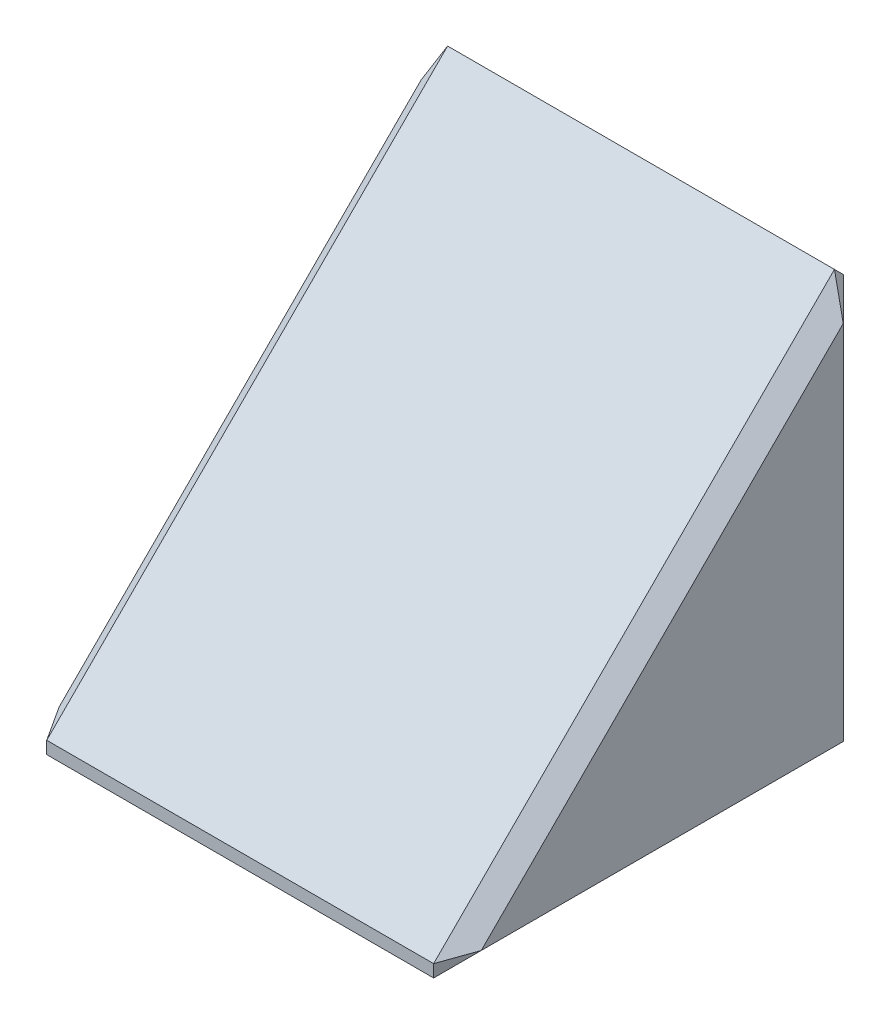
ISO-10303-21;
HEADER;
FILE_DESCRIPTION(('STEP AP214'),'2;1');
FILE_NAME('part.step','',(''),(''),'','','');
FILE_SCHEMA(('AUTOMOTIVE_DESIGN { 1 0 10303 214 1 1 1 1 }'));
ENDSEC;
DATA;
#1=APPLICATION_CONTEXT('core data for automotive mechanical design processes');
#2=APPLICATION_PROTOCOL_DEFINITION('international standard','automotive_design',2000,#1);
#3=PRODUCT_CONTEXT('',#1,'mechanical');
#4=PRODUCT('Part','Part','',(#3));
#5=PRODUCT_RELATED_PRODUCT_CATEGORY('part','',(#4));
#6=PRODUCT_DEFINITION_FORMATION('','',#4);
#7=PRODUCT_DEFINITION_CONTEXT('part definition',#1,'design');
#8=PRODUCT_DEFINITION('design','',#6,#7);
#9=PRODUCT_DEFINITION_SHAPE('','',#8);
#10=(LENGTH_UNIT() NAMED_UNIT(*) SI_UNIT(.MILLI.,.METRE.));
#11=(NAMED_UNIT(*) PLANE_ANGLE_UNIT() SI_UNIT($,.RADIAN.));
#12=(NAMED_UNIT(*) SI_UNIT($,.STERADIAN.) SOLID_ANGLE_UNIT());
#13=UNCERTAINTY_MEASURE_WITH_UNIT(LENGTH_MEASURE(1.E-05),#10,'distance_accuracy_value','');
#14=(GEOMETRIC_REPRESENTATION_CONTEXT(3) GLOBAL_UNCERTAINTY_ASSIGNED_CONTEXT((#13)) GLOBAL_UNIT_ASSIGNED_CONTEXT((#10,
#11,#12)) REPRESENTATION_CONTEXT('',''));
#15=CARTESIAN_POINT('',(0.,0.,0.));
#16=DIRECTION('',(0.,0.,1.));
#17=DIRECTION('',(1.,0.,0.));
#18=AXIS2_PLACEMENT_3D('',#15,#16,#17);
#19=CARTESIAN_POINT('',(1.5,-1.5,1.5));
#20=DIRECTION('',(0.,1.,0.));
#21=DIRECTION('',(0.,0.,1.));
#22=AXIS2_PLACEMENT_3D('',#19,#20,#21);
#23=PLANE('',#22);
#24=DIRECTION('',(0.,0.,1.));
#25=VECTOR('',#24,1.);
#26=CARTESIAN_POINT('',(1.375,-1.5,1.5));
#27=LINE('',#26,#25);
#28=CARTESIAN_POINT('',(1.375,-1.5,-1.375));
#29=VERTEX_POINT('',#28);
#30=CARTESIAN_POINT('',(1.375,-1.5,1.41161165235168));
#31=VERTEX_POINT('',#30);
#32=EDGE_CURVE('E99',#29,#31,#27,.T.);
#33=ORIENTED_EDGE('',*,*,#32,.T.);
#34=DIRECTION('',(-1.,0.,0.));
#35=VECTOR('',#34,1.);
#36=CARTESIAN_POINT('',(1.5,-1.5,1.41161165235168));
#37=LINE('',#36,#35);
#38=CARTESIAN_POINT('',(-1.375,-1.5,1.41161165235168));
#39=VERTEX_POINT('',#38);
#40=EDGE_CURVE('E95',#31,#39,#37,.T.);
#41=ORIENTED_EDGE('',*,*,#40,.T.);
#42=DIRECTION('',(0.,0.,-1.));
#43=VECTOR('',#42,1.);
#44=CARTESIAN_POINT('',(-1.375,-1.5,1.5));
#45=LINE('',#44,#43);
#46=CARTESIAN_POINT('',(-1.375,-1.5,-1.375));
#47=VERTEX_POINT('',#46);
#48=EDGE_CURVE('E90',#39,#47,#45,.T.);
#49=ORIENTED_EDGE('',*,*,#48,.T.);
#50=DIRECTION('',(1.,0.,0.));
#51=VECTOR('',#50,1.);
#52=CARTESIAN_POINT('',(1.5,-1.5,-1.375));
#53=LINE('',#52,#51);
#54=EDGE_CURVE('E92',#47,#29,#53,.T.);
#55=ORIENTED_EDGE('',*,*,#54,.T.);
#56=EDGE_LOOP('',(#33,#41,#49,#55));
#57=FACE_BOUND('',#56,.T.);
#58=ADVANCED_FACE('F15',(#57),#23,.F.);
#59=CARTESIAN_POINT('',(1.5,-1.5,-1.5));
#60=DIRECTION('',(0.,0.,1.));
#61=DIRECTION('',(1.,0.,0.));
#62=AXIS2_PLACEMENT_3D('',#59,#60,#61);
#63=PLANE('',#62);
#64=DIRECTION('',(0.,1.,0.));
#65=VECTOR('',#64,1.);
#66=CARTESIAN_POINT('',(-1.375,-1.5,-1.5));
#67=LINE('',#66,#65);
#68=CARTESIAN_POINT('',(-1.375,-1.375,-1.5));
#69=VERTEX_POINT('',#68);
#70=CARTESIAN_POINT('',(-1.375,1.375,-1.5));
#71=VERTEX_POINT('',#70);
#72=EDGE_CURVE('E186',#69,#71,#67,.T.);
#73=ORIENTED_EDGE('',*,*,#72,.T.);
#74=DIRECTION('',(1.,0.,0.));
#75=VECTOR('',#74,1.);
#76=CARTESIAN_POINT('',(1.5,1.375,-1.5));
#77=LINE('',#76,#75);
#78=CARTESIAN_POINT('',(1.375,1.375,-1.5));
#79=VERTEX_POINT('',#78);
#80=EDGE_CURVE('E188',#71,#79,#77,.T.);
#81=ORIENTED_EDGE('',*,*,#80,.T.);
#82=DIRECTION('',(0.,-1.,0.));
#83=VECTOR('',#82,1.);
#84=CARTESIAN_POINT('',(1.375,-1.5,-1.5));
#85=LINE('',#84,#83);
#86=CARTESIAN_POINT('',(1.375,-1.375,-1.5));
#87=VERTEX_POINT('',#86);
#88=EDGE_CURVE('E182',#79,#87,#85,.T.);
#89=ORIENTED_EDGE('',*,*,#88,.T.);
#90=DIRECTION('',(-1.,0.,0.));
#91=VECTOR('',#90,1.);
#92=CARTESIAN_POINT('',(1.5,-1.375,-1.5));
#93=LINE('',#92,#91);
#94=EDGE_CURVE('E184',#87,#69,#93,.T.);
#95=ORIENTED_EDGE('',*,*,#94,.T.);
#96=EDGE_LOOP('',(#73,#81,#89,#95));
#97=FACE_BOUND('',#96,.T.);
#98=ADVANCED_FACE('F227',(#97),#63,.F.);
#99=CARTESIAN_POINT('',(1.5,-1.5,1.5));
#100=DIRECTION('',(0.,-0.707106781186547,-0.707106781186547));
#101=DIRECTION('',(0.,0.707106781186548,-0.707106781186548));
#102=AXIS2_PLACEMENT_3D('',#99,#100,#101);
#103=PLANE('',#102);
#104=DIRECTION('',(-1.,0.,0.));
#105=VECTOR('',#104,1.);
#106=CARTESIAN_POINT('',(1.5,1.4375,-1.4375));
#107=LINE('',#106,#105);
#108=CARTESIAN_POINT('',(1.375,1.4375,-1.4375));
#109=VERTEX_POINT('',#108);
#110=CARTESIAN_POINT('',(-1.375,1.4375,-1.4375));
#111=VERTEX_POINT('',#110);
#112=EDGE_CURVE('E176',#109,#111,#107,.T.);
#113=ORIENTED_EDGE('',*,*,#112,.T.);
#114=DIRECTION('',(0.,-0.707106781186548,0.707106781186548));
#115=VECTOR('',#114,1.);
#116=CARTESIAN_POINT('',(-1.375,-1.5,1.5));
#117=LINE('',#116,#115);
#118=CARTESIAN_POINT('',(-1.375,-1.41161165235168,1.41161165235168));
#119=VERTEX_POINT('',#118);
#120=EDGE_CURVE('E180',#111,#119,#117,.T.);
#121=ORIENTED_EDGE('',*,*,#120,.T.);
#122=DIRECTION('',(1.,0.,0.));
#123=VECTOR('',#122,1.);
#124=CARTESIAN_POINT('',(1.5,-1.41161165235168,1.41161165235168));
#125=LINE('',#124,#123);
#126=CARTESIAN_POINT('',(1.375,-1.41161165235168,1.41161165235168));
#127=VERTEX_POINT('',#126);
#128=EDGE_CURVE('E178',#119,#127,#125,.T.);
#129=ORIENTED_EDGE('',*,*,#128,.T.);
#130=DIRECTION('',(0.,0.707106781186548,-0.707106781186548));
#131=VECTOR('',#130,1.);
#132=CARTESIAN_POINT('',(1.375,1.5,-1.5));
#133=LINE('',#132,#131);
#134=EDGE_CURVE('E158',#127,#109,#133,.T.);
#135=ORIENTED_EDGE('',*,*,#134,.T.);
#136=EDGE_LOOP('',(#113,#121,#129,#135));
#137=FACE_BOUND('',#136,.T.);
#138=ADVANCED_FACE('F246',(#137),#103,.F.);
#139=CARTESIAN_POINT('',(1.5,0.,0.));
#140=DIRECTION('',(1.,0.,0.));
#141=DIRECTION('',(0.,0.,-1.));
#142=AXIS2_PLACEMENT_3D('',#139,#140,#141);
#143=PLANE('',#142);
#144=DIRECTION('',(0.,1.,0.));
#145=VECTOR('',#144,1.);
#146=CARTESIAN_POINT('',(1.5,1.5,-1.375));
#147=LINE('',#146,#145);
#148=CARTESIAN_POINT('',(1.5,-1.375,-1.375));
#149=VERTEX_POINT('',#148);
#150=CARTESIAN_POINT('',(1.5,1.19822330470336,-1.375));
#151=VERTEX_POINT('',#150);
#152=EDGE_CURVE('E39',#149,#151,#147,.T.);
#153=ORIENTED_EDGE('',*,*,#152,.T.);
#154=DIRECTION('',(0.,-0.707106781186548,0.707106781186548));
#155=VECTOR('',#154,1.);
#156=CARTESIAN_POINT('',(1.5,-1.58838834764832,1.41161165235168));
#157=LINE('',#156,#155);
#158=CARTESIAN_POINT('',(1.5,-1.375,1.19822330470336));
#159=VERTEX_POINT('',#158);
#160=EDGE_CURVE('E10',#151,#159,#157,.T.);
#161=ORIENTED_EDGE('',*,*,#160,.T.);
#162=DIRECTION('',(0.,0.,-1.));
#163=VECTOR('',#162,1.);
#164=CARTESIAN_POINT('',(1.5,-1.375,-1.5));
#165=LINE('',#164,#163);
#166=EDGE_CURVE('E24',#159,#149,#165,.T.);
#167=ORIENTED_EDGE('',*,*,#166,.T.);
#168=EDGE_LOOP('',(#153,#161,#167));
#169=FACE_BOUND('',#168,.T.);
#170=ADVANCED_FACE('F161',(#169),#143,.T.);
#171=CARTESIAN_POINT('',(-1.5,0.,0.));
#172=DIRECTION('',(1.,0.,0.));
#173=DIRECTION('',(0.,0.,-1.));
#174=AXIS2_PLACEMENT_3D('',#171,#172,#173);
#175=PLANE('',#174);
#176=DIRECTION('',(0.,0.,1.));
#177=VECTOR('',#176,1.);
#178=CARTESIAN_POINT('',(-1.5,-1.375,0.));
#179=LINE('',#178,#177);
#180=CARTESIAN_POINT('',(-1.5,-1.375,-1.375));
#181=VERTEX_POINT('',#180);
#182=CARTESIAN_POINT('',(-1.5,-1.375,1.19822330470336));
#183=VERTEX_POINT('',#182);
#184=EDGE_CURVE('E121',#181,#183,#179,.T.);
#185=ORIENTED_EDGE('',*,*,#184,.T.);
#186=DIRECTION('',(0.,0.707106781186548,-0.707106781186548));
#187=VECTOR('',#186,1.);
#188=CARTESIAN_POINT('',(-1.5,-0.0883883476483182,-0.0883883476483182));
#189=LINE('',#188,#187);
#190=CARTESIAN_POINT('',(-1.5,1.19822330470336,-1.375));
#191=VERTEX_POINT('',#190);
#192=EDGE_CURVE('E166',#183,#191,#189,.T.);
#193=ORIENTED_EDGE('',*,*,#192,.T.);
#194=DIRECTION('',(0.,-1.,0.));
#195=VECTOR('',#194,1.);
#196=CARTESIAN_POINT('',(-1.5,0.,-1.375));
#197=LINE('',#196,#195);
#198=EDGE_CURVE('E192',#191,#181,#197,.T.);
#199=ORIENTED_EDGE('',*,*,#198,.T.);
#200=EDGE_LOOP('',(#185,#193,#199));
#201=FACE_BOUND('',#200,.T.);
#202=ADVANCED_FACE('F220',(#201),#175,.F.);
#203=CARTESIAN_POINT('',(1.5,0.,-1.375));
#204=DIRECTION('',(0.707106781186546,0.,-0.707106781186549));
#205=DIRECTION('',(0.,-1.,0.));
#206=AXIS2_PLACEMENT_3D('',#203,#204,#205);
#207=PLANE('',#206);
#208=DIRECTION('',(0.707106781186549,0.,0.707106781186546));
#209=VECTOR('',#208,1.);
#210=CARTESIAN_POINT('',(1.5,-1.375,-1.375));
#211=LINE('',#210,#209);
#212=EDGE_CURVE('E142',#87,#149,#211,.T.);
#213=ORIENTED_EDGE('',*,*,#212,.F.);
#214=ORIENTED_EDGE('',*,*,#88,.F.);
#215=DIRECTION('',(-0.500000000000001,0.707106781186547,-0.499999999999999));
#216=VECTOR('',#215,1.);
#217=CARTESIAN_POINT('',(1.375,1.375,-1.5));
#218=LINE('',#217,#216);
#219=EDGE_CURVE('E144',#151,#79,#218,.T.);
#220=ORIENTED_EDGE('',*,*,#219,.F.);
#221=ORIENTED_EDGE('',*,*,#152,.F.);
#222=EDGE_LOOP('',(#213,#214,#220,#221));
#223=FACE_BOUND('',#222,.T.);
#224=ADVANCED_FACE('F17',(#223),#207,.T.);
#225=CARTESIAN_POINT('',(1.5,-1.375,-1.5));
#226=DIRECTION('',(0.,0.707106781186546,0.707106781186549));
#227=DIRECTION('',(-1.,0.,0.));
#228=AXIS2_PLACEMENT_3D('',#225,#226,#227);
#229=PLANE('',#228);
#230=DIRECTION('',(0.,0.707106781186549,-0.707106781186546));
#231=VECTOR('',#230,1.);
#232=CARTESIAN_POINT('',(-1.375,-1.4375,-1.4375));
#233=LINE('',#232,#231);
#234=EDGE_CURVE('E106',#69,#47,#233,.F.);
#235=ORIENTED_EDGE('',*,*,#234,.F.);
#236=ORIENTED_EDGE('',*,*,#94,.F.);
#237=DIRECTION('',(0.,-0.707106781186549,0.707106781186546));
#238=VECTOR('',#237,1.);
#239=CARTESIAN_POINT('',(1.375,-1.4375,-1.4375));
#240=LINE('',#239,#238);
#241=EDGE_CURVE('E109',#29,#87,#240,.F.);
#242=ORIENTED_EDGE('',*,*,#241,.F.);
#243=ORIENTED_EDGE('',*,*,#54,.F.);
#244=EDGE_LOOP('',(#235,#236,#242,#243));
#245=FACE_BOUND('',#244,.T.);
#246=ADVANCED_FACE('F104',(#245),#229,.F.);
#247=CARTESIAN_POINT('',(-1.375,-1.5,-1.5));
#248=DIRECTION('',(0.707106781186546,0.,0.707106781186549));
#249=DIRECTION('',(0.,1.,0.));
#250=AXIS2_PLACEMENT_3D('',#247,#248,#249);
#251=PLANE('',#250);
#252=DIRECTION('',(0.500000000000001,0.707106781186548,-0.499999999999999));
#253=VECTOR('',#252,1.);
#254=CARTESIAN_POINT('',(-1.36852791308792,1.38415291308792,-1.50647208691208));
#255=LINE('',#254,#253);
#256=EDGE_CURVE('E137',#71,#191,#255,.F.);
#257=ORIENTED_EDGE('',*,*,#256,.F.);
#258=ORIENTED_EDGE('',*,*,#72,.F.);
#259=DIRECTION('',(-0.707106781186549,0.,0.707106781186546));
#260=VECTOR('',#259,1.);
#261=CARTESIAN_POINT('',(-1.5,-1.375,-1.375));
#262=LINE('',#261,#260);
#263=EDGE_CURVE('E118',#181,#69,#262,.F.);
#264=ORIENTED_EDGE('',*,*,#263,.F.);
#265=ORIENTED_EDGE('',*,*,#198,.F.);
#266=EDGE_LOOP('',(#257,#258,#264,#265));
#267=FACE_BOUND('',#266,.T.);
#268=ADVANCED_FACE('F225',(#267),#251,.F.);
#269=CARTESIAN_POINT('',(1.5,1.4375,-1.4375));
#270=DIRECTION('',(0.,-0.707106781186555,0.70710678118654));
#271=DIRECTION('',(-1.,0.,0.));
#272=AXIS2_PLACEMENT_3D('',#269,#270,#271);
#273=PLANE('',#272);
#274=DIRECTION('',(0.,-0.70710678118654,-0.707106781186555));
#275=VECTOR('',#274,1.);
#276=CARTESIAN_POINT('',(1.375,1.375,-1.5));
#277=LINE('',#276,#275);
#278=EDGE_CURVE('E19',#79,#109,#277,.F.);
#279=ORIENTED_EDGE('',*,*,#278,.F.);
#280=ORIENTED_EDGE('',*,*,#80,.F.);
#281=DIRECTION('',(0.,0.70710678118654,0.707106781186555));
#282=VECTOR('',#281,1.);
#283=CARTESIAN_POINT('',(-1.375,1.4375,-1.4375));
#284=LINE('',#283,#282);
#285=EDGE_CURVE('E134',#111,#71,#284,.F.);
#286=ORIENTED_EDGE('',*,*,#285,.F.);
#287=ORIENTED_EDGE('',*,*,#112,.F.);
#288=EDGE_LOOP('',(#279,#280,#286,#287));
#289=FACE_BOUND('',#288,.T.);
#290=ADVANCED_FACE('F229',(#289),#273,.F.);
#291=CARTESIAN_POINT('',(1.375,1.375,-1.5));
#292=DIRECTION('',(0.862856209461016,0.357406744336596,-0.357406744336592));
#293=DIRECTION('',(-0.382683432365093,0.923879532511286,0.));
#294=AXIS2_PLACEMENT_3D('',#291,#292,#293);
#295=PLANE('',#294);
#296=ORIENTED_EDGE('',*,*,#219,.T.);
#297=ORIENTED_EDGE('',*,*,#278,.T.);
#298=DIRECTION('',(0.451100166003605,-0.863502055752851,0.225550083001801));
#299=VECTOR('',#298,1.);
#300=CARTESIAN_POINT('',(1.39298626505065,1.40307044750362,-1.42850686747468));
#301=LINE('',#300,#299);
#302=EDGE_CURVE('E126',#151,#109,#301,.F.);
#303=ORIENTED_EDGE('',*,*,#302,.F.);
#304=EDGE_LOOP('',(#296,#297,#303));
#305=FACE_BOUND('',#304,.T.);
#306=ADVANCED_FACE('F149',(#305),#295,.T.);
#307=CARTESIAN_POINT('',(1.5,-1.375,-1.375));
#308=DIRECTION('',(0.577350269189624,-0.577350269189626,-0.577350269189628));
#309=DIRECTION('',(0.,0.707106781186549,-0.707106781186546));
#310=AXIS2_PLACEMENT_3D('',#307,#308,#309);
#311=PLANE('',#310);
#312=ORIENTED_EDGE('',*,*,#241,.T.);
#313=ORIENTED_EDGE('',*,*,#212,.T.);
#314=DIRECTION('',(-0.707106781186549,-0.707106781186546,0.));
#315=VECTOR('',#314,1.);
#316=CARTESIAN_POINT('',(1.5,-1.375,-1.375));
#317=LINE('',#316,#315);
#318=EDGE_CURVE('E122',#29,#149,#317,.F.);
#319=ORIENTED_EDGE('',*,*,#318,.F.);
#320=EDGE_LOOP('',(#312,#313,#319));
#321=FACE_BOUND('',#320,.T.);
#322=ADVANCED_FACE('F169',(#321),#311,.T.);
#323=CARTESIAN_POINT('',(-1.5,-1.375,-1.375));
#324=DIRECTION('',(-0.577350269189626,-0.577350269189624,-0.577350269189628));
#325=DIRECTION('',(-0.707106781186549,0.,0.707106781186546));
#326=AXIS2_PLACEMENT_3D('',#323,#324,#325);
#327=PLANE('',#326);
#328=ORIENTED_EDGE('',*,*,#263,.T.);
#329=ORIENTED_EDGE('',*,*,#234,.T.);
#330=DIRECTION('',(0.707106781186546,-0.707106781186549,0.));
#331=VECTOR('',#330,1.);
#332=CARTESIAN_POINT('',(-1.5,-1.375,-1.375));
#333=LINE('',#332,#331);
#334=EDGE_CURVE('E115',#181,#47,#333,.T.);
#335=ORIENTED_EDGE('',*,*,#334,.F.);
#336=EDGE_LOOP('',(#328,#329,#335));
#337=FACE_BOUND('',#336,.T.);
#338=ADVANCED_FACE('F114',(#337),#327,.T.);
#339=CARTESIAN_POINT('',(-1.375,1.4375,-1.4375));
#340=DIRECTION('',(-0.862856209461016,0.357406744336595,-0.357406744336593));
#341=DIRECTION('',(-0.382683432365091,-0.923879532511286,0.));
#342=AXIS2_PLACEMENT_3D('',#339,#340,#341);
#343=PLANE('',#342);
#344=ORIENTED_EDGE('',*,*,#285,.T.);
#345=ORIENTED_EDGE('',*,*,#256,.T.);
#346=DIRECTION('',(-0.451100166003604,-0.863502055752852,0.2255500830018));
#347=VECTOR('',#346,1.);
#348=CARTESIAN_POINT('',(-1.375,1.4375,-1.4375));
#349=LINE('',#348,#347);
#350=EDGE_CURVE('E123',#111,#191,#349,.T.);
#351=ORIENTED_EDGE('',*,*,#350,.F.);
#352=EDGE_LOOP('',(#344,#345,#351));
#353=FACE_BOUND('',#352,.T.);
#354=ADVANCED_FACE('F231',(#353),#343,.T.);
#355=CARTESIAN_POINT('',(1.5,-0.0883883476483179,-0.0883883476483179));
#356=DIRECTION('',(0.707106781186546,0.500000000000001,0.500000000000001));
#357=DIRECTION('',(0.,0.707106781186548,-0.707106781186548));
#358=AXIS2_PLACEMENT_3D('',#355,#356,#357);
#359=PLANE('',#358);
#360=ORIENTED_EDGE('',*,*,#302,.T.);
#361=ORIENTED_EDGE('',*,*,#134,.F.);
#362=DIRECTION('',(-0.500000000000001,-0.146446609406727,0.853553390593273));
#363=VECTOR('',#362,1.);
#364=CARTESIAN_POINT('',(1.375,-1.41161165235168,1.41161165235168));
#365=LINE('',#364,#363);
#366=EDGE_CURVE('E128',#159,#127,#365,.T.);
#367=ORIENTED_EDGE('',*,*,#366,.F.);
#368=ORIENTED_EDGE('',*,*,#160,.F.);
#369=EDGE_LOOP('',(#360,#361,#367,#368));
#370=FACE_BOUND('',#369,.T.);
#371=ADVANCED_FACE('F157',(#370),#359,.T.);
#372=CARTESIAN_POINT('',(1.5,-1.375,0.));
#373=DIRECTION('',(0.707106781186546,-0.707106781186549,0.));
#374=DIRECTION('',(0.,0.,1.));
#375=AXIS2_PLACEMENT_3D('',#372,#373,#374);
#376=PLANE('',#375);
#377=ORIENTED_EDGE('',*,*,#318,.T.);
#378=ORIENTED_EDGE('',*,*,#166,.F.);
#379=DIRECTION('',(0.451100166003605,0.451100166003603,-0.770076152379128));
#380=VECTOR('',#379,1.);
#381=CARTESIAN_POINT('',(1.39298626505065,-1.48201373494935,1.38090717731551));
#382=LINE('',#381,#380);
#383=EDGE_CURVE('E32',#31,#159,#382,.T.);
#384=ORIENTED_EDGE('',*,*,#383,.F.);
#385=ORIENTED_EDGE('',*,*,#32,.F.);
#386=EDGE_LOOP('',(#377,#378,#384,#385));
#387=FACE_BOUND('',#386,.T.);
#388=ADVANCED_FACE('F171',(#387),#376,.T.);
#389=CARTESIAN_POINT('',(-1.375,-1.5,1.5));
#390=DIRECTION('',(0.707106781186549,0.707106781186546,0.));
#391=DIRECTION('',(0.,0.,-1.));
#392=AXIS2_PLACEMENT_3D('',#389,#390,#391);
#393=PLANE('',#392);
#394=ORIENTED_EDGE('',*,*,#334,.T.);
#395=ORIENTED_EDGE('',*,*,#48,.F.);
#396=DIRECTION('',(-0.451100166003603,0.451100166003604,-0.770076152379129));
#397=VECTOR('',#396,1.);
#398=CARTESIAN_POINT('',(-1.375,-1.5,1.41161165235168));
#399=LINE('',#398,#397);
#400=EDGE_CURVE('E203',#183,#39,#399,.F.);
#401=ORIENTED_EDGE('',*,*,#400,.F.);
#402=ORIENTED_EDGE('',*,*,#184,.F.);
#403=EDGE_LOOP('',(#394,#395,#401,#402));
#404=FACE_BOUND('',#403,.T.);
#405=ADVANCED_FACE('F120',(#404),#393,.F.);
#406=CARTESIAN_POINT('',(-1.375,-1.5,1.5));
#407=DIRECTION('',(0.707106781186548,-0.5,-0.5));
#408=DIRECTION('',(0.,-0.707106781186548,0.707106781186548));
#409=AXIS2_PLACEMENT_3D('',#406,#407,#408);
#410=PLANE('',#409);
#411=ORIENTED_EDGE('',*,*,#350,.T.);
#412=ORIENTED_EDGE('',*,*,#192,.F.);
#413=DIRECTION('',(0.499999999999999,-0.146446609406726,0.853553390593274));
#414=VECTOR('',#413,1.);
#415=CARTESIAN_POINT('',(-1.36852791308792,-1.4135072827198,1.42266019580772));
#416=LINE('',#415,#414);
#417=EDGE_CURVE('E200',#119,#183,#416,.F.);
#418=ORIENTED_EDGE('',*,*,#417,.F.);
#419=ORIENTED_EDGE('',*,*,#120,.F.);
#420=EDGE_LOOP('',(#411,#412,#418,#419));
#421=FACE_BOUND('',#420,.T.);
#422=ADVANCED_FACE('F217',(#421),#410,.F.);
#423=CARTESIAN_POINT('',(1.375,-1.41161165235168,1.41161165235168));
#424=DIRECTION('',(0.862856209461016,0.,0.505449465124424));
#425=DIRECTION('',(0.505449465124424,0.,-0.862856209461017));
#426=AXIS2_PLACEMENT_3D('',#423,#424,#425);
#427=PLANE('',#426);
#428=ORIENTED_EDGE('',*,*,#383,.T.);
#429=ORIENTED_EDGE('',*,*,#366,.T.);
#430=DIRECTION('',(0.,1.,0.));
#431=VECTOR('',#430,1.);
#432=CARTESIAN_POINT('',(1.375,-1.41161165235168,1.41161165235168));
#433=LINE('',#432,#431);
#434=EDGE_CURVE('E198',#31,#127,#433,.T.);
#435=ORIENTED_EDGE('',*,*,#434,.F.);
#436=EDGE_LOOP('',(#428,#429,#435));
#437=FACE_BOUND('',#436,.T.);
#438=ADVANCED_FACE('F206',(#437),#427,.T.);
#439=CARTESIAN_POINT('',(-1.375,-1.5,1.41161165235168));
#440=DIRECTION('',(-0.862856209461017,0.,0.505449465124423));
#441=DIRECTION('',(0.505449465124423,0.,0.862856209461017));
#442=AXIS2_PLACEMENT_3D('',#439,#440,#441);
#443=PLANE('',#442);
#444=ORIENTED_EDGE('',*,*,#417,.T.);
#445=ORIENTED_EDGE('',*,*,#400,.T.);
#446=DIRECTION('',(0.,-1.,0.));
#447=VECTOR('',#446,1.);
#448=CARTESIAN_POINT('',(-1.375,-1.5,1.41161165235168));
#449=LINE('',#448,#447);
#450=EDGE_CURVE('E196',#119,#39,#449,.T.);
#451=ORIENTED_EDGE('',*,*,#450,.F.);
#452=EDGE_LOOP('',(#444,#445,#451));
#453=FACE_BOUND('',#452,.T.);
#454=ADVANCED_FACE('F212',(#453),#443,.T.);
#455=CARTESIAN_POINT('',(1.5,-1.5,1.41161165235168));
#456=DIRECTION('',(0.,0.,-1.));
#457=DIRECTION('',(-1.,0.,0.));
#458=AXIS2_PLACEMENT_3D('',#455,#456,#457);
#459=PLANE('',#458);
#460=ORIENTED_EDGE('',*,*,#434,.T.);
#461=ORIENTED_EDGE('',*,*,#128,.F.);
#462=ORIENTED_EDGE('',*,*,#450,.T.);
#463=ORIENTED_EDGE('',*,*,#40,.F.);
#464=EDGE_LOOP('',(#460,#461,#462,#463));
#465=FACE_BOUND('',#464,.T.);
#466=ADVANCED_FACE('F209',(#465),#459,.F.);
#467=CLOSED_SHELL('',(#58,#98,#138,#170,#202,#224,#246,#268,#290,#306,#322,#338,#354,#371,#388,
#405,#422,#438,#454,#466));
#468=MANIFOLD_SOLID_BREP('B1',#467);
#469=ADVANCED_BREP_SHAPE_REPRESENTATION('',(#18,#468),#14);
#470=SHAPE_DEFINITION_REPRESENTATION(#9,#469);
ENDSEC;
END-ISO-10303-21;
